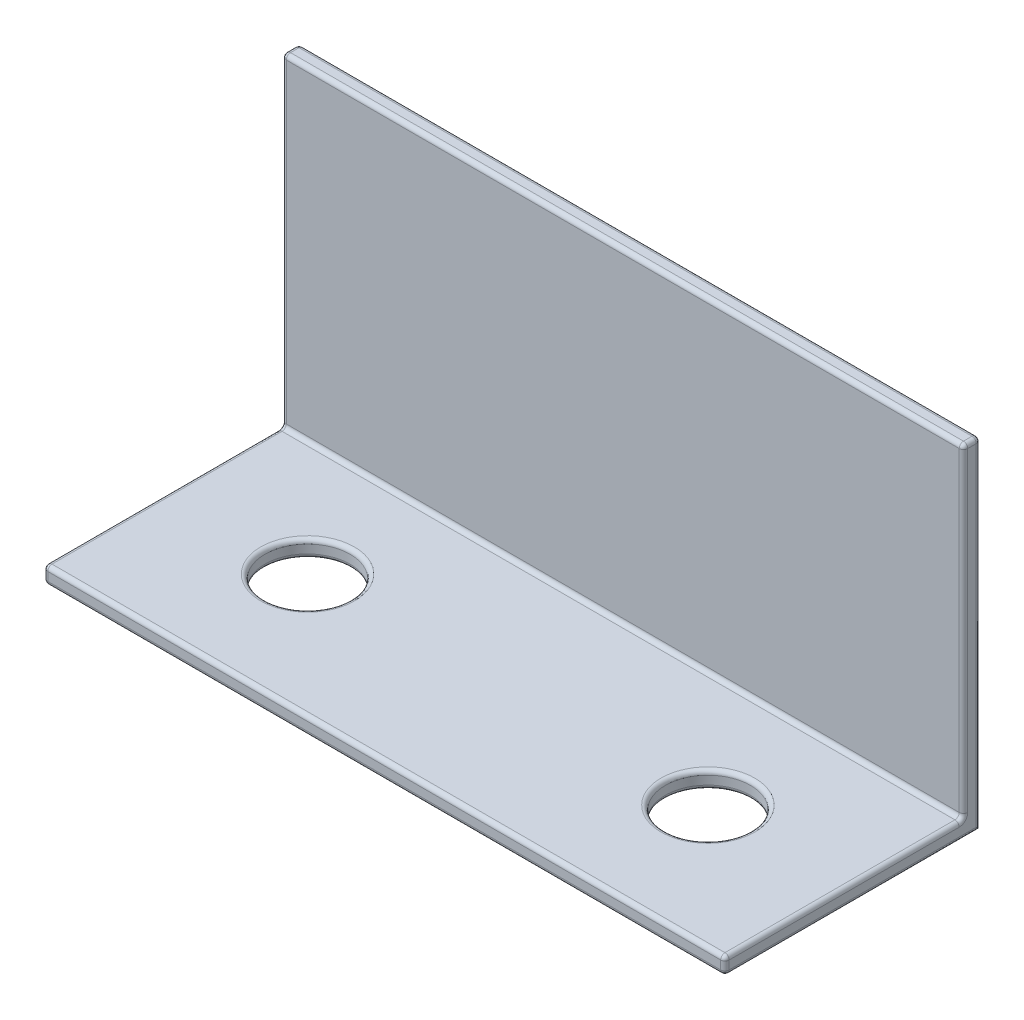
ISO-10303-21;
HEADER;
FILE_DESCRIPTION(('STEP AP214'),'2;1');
FILE_NAME('part.step','',(''),(''),'','','');
FILE_SCHEMA(('AUTOMOTIVE_DESIGN { 1 0 10303 214 1 1 1 1 }'));
ENDSEC;
DATA;
#1=APPLICATION_CONTEXT('core data for automotive mechanical design processes');
#2=APPLICATION_PROTOCOL_DEFINITION('international standard','automotive_design',2000,#1);
#3=PRODUCT_CONTEXT('',#1,'mechanical');
#4=PRODUCT('Part','Part','',(#3));
#5=PRODUCT_RELATED_PRODUCT_CATEGORY('part','',(#4));
#6=PRODUCT_DEFINITION_FORMATION('','',#4);
#7=PRODUCT_DEFINITION_CONTEXT('part definition',#1,'design');
#8=PRODUCT_DEFINITION('design','',#6,#7);
#9=PRODUCT_DEFINITION_SHAPE('','',#8);
#10=(LENGTH_UNIT() NAMED_UNIT(*) SI_UNIT(.MILLI.,.METRE.));
#11=(NAMED_UNIT(*) PLANE_ANGLE_UNIT() SI_UNIT($,.RADIAN.));
#12=(NAMED_UNIT(*) SI_UNIT($,.STERADIAN.) SOLID_ANGLE_UNIT());
#13=UNCERTAINTY_MEASURE_WITH_UNIT(LENGTH_MEASURE(1.E-05),#10,'distance_accuracy_value','');
#14=(GEOMETRIC_REPRESENTATION_CONTEXT(3) GLOBAL_UNCERTAINTY_ASSIGNED_CONTEXT((#13)) GLOBAL_UNIT_ASSIGNED_CONTEXT((#10,
#11,#12)) REPRESENTATION_CONTEXT('',''));
#15=CARTESIAN_POINT('',(0.,0.,0.));
#16=DIRECTION('',(0.,0.,1.));
#17=DIRECTION('',(1.,0.,0.));
#18=AXIS2_PLACEMENT_3D('',#15,#16,#17);
#19=CARTESIAN_POINT('',(40.,0.,0.));
#20=DIRECTION('',(-1.,0.,0.));
#21=DIRECTION('',(0.,0.,1.));
#22=AXIS2_PLACEMENT_3D('',#19,#20,#21);
#23=PLANE('',#22);
#24=CARTESIAN_POINT('',(40.,0.25,-13.75));
#25=DIRECTION('',(-1.,0.,0.));
#26=DIRECTION('',(0.,0.,1.));
#27=AXIS2_PLACEMENT_3D('',#24,#25,#26);
#28=CIRCLE('',#27,0.5);
#29=CARTESIAN_POINT('',(40.,-0.25,-13.75));
#30=VERTEX_POINT('',#29);
#31=CARTESIAN_POINT('',(40.,0.25,-14.25));
#32=VERTEX_POINT('',#31);
#33=EDGE_CURVE('E255',#30,#32,#28,.F.);
#34=ORIENTED_EDGE('',*,*,#33,.F.);
#35=DIRECTION('',(0.,0.,1.));
#36=VECTOR('',#35,1.);
#37=CARTESIAN_POINT('',(40.,-0.25,0.));
#38=LINE('',#37,#36);
#39=CARTESIAN_POINT('',(40.,-0.25,-0.25));
#40=VERTEX_POINT('',#39);
#41=EDGE_CURVE('E252',#30,#40,#38,.T.);
#42=ORIENTED_EDGE('',*,*,#41,.T.);
#43=DIRECTION('',(0.,-1.,0.));
#44=VECTOR('',#43,1.);
#45=CARTESIAN_POINT('',(40.,0.,-0.25));
#46=LINE('',#45,#44);
#47=CARTESIAN_POINT('',(40.,-0.75,-0.25));
#48=VERTEX_POINT('',#47);
#49=EDGE_CURVE('E243',#40,#48,#46,.T.);
#50=ORIENTED_EDGE('',*,*,#49,.T.);
#51=DIRECTION('',(0.,0.,-1.));
#52=VECTOR('',#51,1.);
#53=CARTESIAN_POINT('',(40.,-0.75,0.));
#54=LINE('',#53,#52);
#55=CARTESIAN_POINT('',(40.,-0.749999999999998,-14.75));
#56=VERTEX_POINT('',#55);
#57=EDGE_CURVE('E245',#48,#56,#54,.T.);
#58=ORIENTED_EDGE('',*,*,#57,.T.);
#59=DIRECTION('',(0.,1.,0.));
#60=VECTOR('',#59,1.);
#61=CARTESIAN_POINT('',(40.,0.,-14.75));
#62=LINE('',#61,#60);
#63=CARTESIAN_POINT('',(40.,18.75,-14.75));
#64=VERTEX_POINT('',#63);
#65=EDGE_CURVE('E184',#56,#64,#62,.T.);
#66=ORIENTED_EDGE('',*,*,#65,.T.);
#67=DIRECTION('',(0.,0.,1.));
#68=VECTOR('',#67,1.);
#69=CARTESIAN_POINT('',(40.,18.75,0.));
#70=LINE('',#69,#68);
#71=CARTESIAN_POINT('',(40.,18.75,-14.25));
#72=VERTEX_POINT('',#71);
#73=EDGE_CURVE('E248',#64,#72,#70,.T.);
#74=ORIENTED_EDGE('',*,*,#73,.T.);
#75=DIRECTION('',(0.,-1.,0.));
#76=VECTOR('',#75,1.);
#77=CARTESIAN_POINT('',(40.,0.,-14.25));
#78=LINE('',#77,#76);
#79=EDGE_CURVE('E250',#72,#32,#78,.T.);
#80=ORIENTED_EDGE('',*,*,#79,.T.);
#81=EDGE_LOOP('',(#34,#42,#50,#58,#66,#74,#80));
#82=FACE_BOUND('',#81,.T.);
#83=ADVANCED_FACE('F33',(#82),#23,.F.);
#84=CARTESIAN_POINT('',(40.,-1.,0.));
#85=DIRECTION('',(0.,0.,-1.));
#86=DIRECTION('',(-1.,0.,0.));
#87=AXIS2_PLACEMENT_3D('',#84,#85,#86);
#88=PLANE('',#87);
#89=DIRECTION('',(0.,-1.,0.));
#90=VECTOR('',#89,1.);
#91=CARTESIAN_POINT('',(39.75,-1.,0.));
#92=LINE('',#91,#90);
#93=CARTESIAN_POINT('',(39.75,-0.75,0.));
#94=VERTEX_POINT('',#93);
#95=CARTESIAN_POINT('',(39.75,-0.25,0.));
#96=VERTEX_POINT('',#95);
#97=EDGE_CURVE('E48',#94,#96,#92,.F.);
#98=ORIENTED_EDGE('',*,*,#97,.T.);
#99=DIRECTION('',(-1.,0.,0.));
#100=VECTOR('',#99,1.);
#101=CARTESIAN_POINT('',(40.,-0.25,0.));
#102=LINE('',#101,#100);
#103=CARTESIAN_POINT('',(0.25,-0.25,0.));
#104=VERTEX_POINT('',#103);
#105=EDGE_CURVE('E262',#96,#104,#102,.T.);
#106=ORIENTED_EDGE('',*,*,#105,.T.);
#107=DIRECTION('',(0.,-1.,0.));
#108=VECTOR('',#107,1.);
#109=CARTESIAN_POINT('',(0.25,-1.,0.));
#110=LINE('',#109,#108);
#111=CARTESIAN_POINT('',(0.25,-0.75,0.));
#112=VERTEX_POINT('',#111);
#113=EDGE_CURVE('E258',#104,#112,#110,.T.);
#114=ORIENTED_EDGE('',*,*,#113,.T.);
#115=DIRECTION('',(-1.,0.,0.));
#116=VECTOR('',#115,1.);
#117=CARTESIAN_POINT('',(40.,-0.75,0.));
#118=LINE('',#117,#116);
#119=EDGE_CURVE('E53',#112,#94,#118,.F.);
#120=ORIENTED_EDGE('',*,*,#119,.T.);
#121=EDGE_LOOP('',(#98,#106,#114,#120));
#122=FACE_BOUND('',#121,.T.);
#123=ADVANCED_FACE('F391',(#122),#88,.F.);
#124=CARTESIAN_POINT('',(40.,-0.999999999999998,-15.));
#125=DIRECTION('',(0.,1.,0.));
#126=DIRECTION('',(0.,0.,1.));
#127=AXIS2_PLACEMENT_3D('',#124,#125,#126);
#128=PLANE('',#127);
#129=CARTESIAN_POINT('',(31.75,-0.999999999999999,-7.25));
#130=DIRECTION('',(0.,1.,0.));
#131=DIRECTION('',(0.,0.,1.));
#132=AXIS2_PLACEMENT_3D('',#129,#130,#131);
#133=CIRCLE('',#132,2.75);
#134=CARTESIAN_POINT('',(31.75,-0.999999999999999,-4.5));
#135=VERTEX_POINT('',#134);
#136=EDGE_CURVE('E354',#135,#135,#133,.T.);
#137=ORIENTED_EDGE('',*,*,#136,.T.);
#138=EDGE_LOOP('',(#137));
#139=FACE_BOUND('',#138,.T.);
#140=CARTESIAN_POINT('',(8.25,-0.999999999999999,-7.25));
#141=DIRECTION('',(0.,1.,0.));
#142=DIRECTION('',(0.,0.,1.));
#143=AXIS2_PLACEMENT_3D('',#140,#141,#142);
#144=CIRCLE('',#143,2.75);
#145=CARTESIAN_POINT('',(8.25,-0.999999999999999,-4.5));
#146=VERTEX_POINT('',#145);
#147=EDGE_CURVE('E351',#146,#146,#144,.T.);
#148=ORIENTED_EDGE('',*,*,#147,.T.);
#149=EDGE_LOOP('',(#148));
#150=FACE_BOUND('',#149,.T.);
#151=DIRECTION('',(-1.,0.,0.));
#152=VECTOR('',#151,1.);
#153=CARTESIAN_POINT('',(40.,-1.,-0.25));
#154=LINE('',#153,#152);
#155=CARTESIAN_POINT('',(39.75,-1.,-0.25));
#156=VERTEX_POINT('',#155);
#157=CARTESIAN_POINT('',(0.25,-1.,-0.25));
#158=VERTEX_POINT('',#157);
#159=EDGE_CURVE('E177',#156,#158,#154,.T.);
#160=ORIENTED_EDGE('',*,*,#159,.T.);
#161=DIRECTION('',(0.,0.,-1.));
#162=VECTOR('',#161,1.);
#163=CARTESIAN_POINT('',(0.25,-0.999999999999998,-15.));
#164=LINE('',#163,#162);
#165=CARTESIAN_POINT('',(0.25,-0.999999999999998,-15.));
#166=VERTEX_POINT('',#165);
#167=EDGE_CURVE('E176',#158,#166,#164,.T.);
#168=ORIENTED_EDGE('',*,*,#167,.T.);
#169=DIRECTION('',(-1.,0.,0.));
#170=VECTOR('',#169,1.);
#171=CARTESIAN_POINT('',(40.,-0.999999999999998,-15.));
#172=LINE('',#171,#170);
#173=CARTESIAN_POINT('',(39.75,-0.999999999999998,-15.));
#174=VERTEX_POINT('',#173);
#175=EDGE_CURVE('E160',#174,#166,#172,.T.);
#176=ORIENTED_EDGE('',*,*,#175,.F.);
#177=DIRECTION('',(0.,0.,-1.));
#178=VECTOR('',#177,1.);
#179=CARTESIAN_POINT('',(39.75,-0.999999999999998,-15.));
#180=LINE('',#179,#178);
#181=EDGE_CURVE('E173',#174,#156,#180,.F.);
#182=ORIENTED_EDGE('',*,*,#181,.T.);
#183=EDGE_LOOP('',(#160,#168,#176,#182));
#184=FACE_BOUND('',#183,.T.);
#185=ADVANCED_FACE('F171',(#139,#150,#184),#128,.F.);
#186=CARTESIAN_POINT('',(40.,19.,-15.));
#187=DIRECTION('',(0.,0.,1.));
#188=DIRECTION('',(0.,-1.,0.));
#189=AXIS2_PLACEMENT_3D('',#186,#187,#188);
#190=PLANE('',#189);
#191=ORIENTED_EDGE('',*,*,#175,.T.);
#192=DIRECTION('',(0.,1.,0.));
#193=VECTOR('',#192,1.);
#194=CARTESIAN_POINT('',(0.25,19.,-15.));
#195=LINE('',#194,#193);
#196=CARTESIAN_POINT('',(0.25,18.75,-15.));
#197=VERTEX_POINT('',#196);
#198=EDGE_CURVE('E214',#166,#197,#195,.T.);
#199=ORIENTED_EDGE('',*,*,#198,.T.);
#200=DIRECTION('',(-1.,0.,0.));
#201=VECTOR('',#200,1.);
#202=CARTESIAN_POINT('',(40.,18.75,-15.));
#203=LINE('',#202,#201);
#204=CARTESIAN_POINT('',(39.75,18.75,-15.));
#205=VERTEX_POINT('',#204);
#206=EDGE_CURVE('E162',#197,#205,#203,.F.);
#207=ORIENTED_EDGE('',*,*,#206,.T.);
#208=DIRECTION('',(0.,1.,0.));
#209=VECTOR('',#208,1.);
#210=CARTESIAN_POINT('',(39.75,19.,-15.));
#211=LINE('',#210,#209);
#212=EDGE_CURVE('E157',#205,#174,#211,.F.);
#213=ORIENTED_EDGE('',*,*,#212,.T.);
#214=EDGE_LOOP('',(#191,#199,#207,#213));
#215=FACE_BOUND('',#214,.T.);
#216=ADVANCED_FACE('F159',(#215),#190,.F.);
#217=CARTESIAN_POINT('',(40.,19.,-14.));
#218=DIRECTION('',(0.,-1.,0.));
#219=DIRECTION('',(0.,0.,-1.));
#220=AXIS2_PLACEMENT_3D('',#217,#218,#219);
#221=PLANE('',#220);
#222=DIRECTION('',(-1.,0.,0.));
#223=VECTOR('',#222,1.);
#224=CARTESIAN_POINT('',(40.,19.,-14.75));
#225=LINE('',#224,#223);
#226=CARTESIAN_POINT('',(39.75,19.,-14.75));
#227=VERTEX_POINT('',#226);
#228=CARTESIAN_POINT('',(0.25,19.,-14.75));
#229=VERTEX_POINT('',#228);
#230=EDGE_CURVE('E238',#227,#229,#225,.T.);
#231=ORIENTED_EDGE('',*,*,#230,.T.);
#232=DIRECTION('',(0.,0.,1.));
#233=VECTOR('',#232,1.);
#234=CARTESIAN_POINT('',(0.25,19.,-14.));
#235=LINE('',#234,#233);
#236=CARTESIAN_POINT('',(0.25,19.,-14.25));
#237=VERTEX_POINT('',#236);
#238=EDGE_CURVE('E241',#229,#237,#235,.T.);
#239=ORIENTED_EDGE('',*,*,#238,.T.);
#240=DIRECTION('',(-1.,0.,0.));
#241=VECTOR('',#240,1.);
#242=CARTESIAN_POINT('',(40.,19.,-14.25));
#243=LINE('',#242,#241);
#244=CARTESIAN_POINT('',(39.75,19.,-14.25));
#245=VERTEX_POINT('',#244);
#246=EDGE_CURVE('E236',#237,#245,#243,.F.);
#247=ORIENTED_EDGE('',*,*,#246,.T.);
#248=DIRECTION('',(0.,0.,1.));
#249=VECTOR('',#248,1.);
#250=CARTESIAN_POINT('',(39.75,19.,-14.));
#251=LINE('',#250,#249);
#252=EDGE_CURVE('E234',#245,#227,#251,.F.);
#253=ORIENTED_EDGE('',*,*,#252,.T.);
#254=EDGE_LOOP('',(#231,#239,#247,#253));
#255=FACE_BOUND('',#254,.T.);
#256=ADVANCED_FACE('F409',(#255),#221,.F.);
#257=CARTESIAN_POINT('',(40.,0.,-14.));
#258=DIRECTION('',(0.,0.,-1.));
#259=DIRECTION('',(-1.,0.,0.));
#260=AXIS2_PLACEMENT_3D('',#257,#258,#259);
#261=PLANE('',#260);
#262=DIRECTION('',(-1.,0.,0.));
#263=VECTOR('',#262,1.);
#264=CARTESIAN_POINT('',(40.,18.75,-14.));
#265=LINE('',#264,#263);
#266=CARTESIAN_POINT('',(39.75,18.75,-14.));
#267=VERTEX_POINT('',#266);
#268=CARTESIAN_POINT('',(0.25,18.75,-14.));
#269=VERTEX_POINT('',#268);
#270=EDGE_CURVE('E220',#267,#269,#265,.T.);
#271=ORIENTED_EDGE('',*,*,#270,.T.);
#272=DIRECTION('',(0.,-1.,0.));
#273=VECTOR('',#272,1.);
#274=CARTESIAN_POINT('',(0.25,0.,-14.));
#275=LINE('',#274,#273);
#276=CARTESIAN_POINT('',(0.25,0.25,-14.));
#277=VERTEX_POINT('',#276);
#278=EDGE_CURVE('E222',#269,#277,#275,.T.);
#279=ORIENTED_EDGE('',*,*,#278,.T.);
#280=DIRECTION('',(-1.,0.,0.));
#281=VECTOR('',#280,1.);
#282=CARTESIAN_POINT('',(40.,0.25,-14.));
#283=LINE('',#282,#281);
#284=CARTESIAN_POINT('',(39.75,0.25,-14.));
#285=VERTEX_POINT('',#284);
#286=EDGE_CURVE('E216',#277,#285,#283,.F.);
#287=ORIENTED_EDGE('',*,*,#286,.T.);
#288=DIRECTION('',(0.,-1.,0.));
#289=VECTOR('',#288,1.);
#290=CARTESIAN_POINT('',(39.75,0.,-14.));
#291=LINE('',#290,#289);
#292=EDGE_CURVE('E218',#285,#267,#291,.F.);
#293=ORIENTED_EDGE('',*,*,#292,.T.);
#294=EDGE_LOOP('',(#271,#279,#287,#293));
#295=FACE_BOUND('',#294,.T.);
#296=ADVANCED_FACE('F405',(#295),#261,.F.);
#297=CARTESIAN_POINT('',(40.,0.,0.));
#298=DIRECTION('',(0.,-1.,0.));
#299=DIRECTION('',(0.,0.,-1.));
#300=AXIS2_PLACEMENT_3D('',#297,#298,#299);
#301=PLANE('',#300);
#302=CARTESIAN_POINT('',(8.25,0.,-7.25));
#303=DIRECTION('',(0.,-1.,0.));
#304=DIRECTION('',(0.,0.,-1.));
#305=AXIS2_PLACEMENT_3D('',#302,#303,#304);
#306=CIRCLE('',#305,2.75);
#307=CARTESIAN_POINT('',(8.25,0.,-10.));
#308=VERTEX_POINT('',#307);
#309=EDGE_CURVE('E11',#308,#308,#306,.T.);
#310=ORIENTED_EDGE('',*,*,#309,.T.);
#311=EDGE_LOOP('',(#310));
#312=FACE_BOUND('',#311,.T.);
#313=CARTESIAN_POINT('',(31.75,0.,-7.25));
#314=DIRECTION('',(0.,-1.,0.));
#315=DIRECTION('',(0.,0.,-1.));
#316=AXIS2_PLACEMENT_3D('',#313,#314,#315);
#317=CIRCLE('',#316,2.75);
#318=CARTESIAN_POINT('',(31.75,0.,-10.));
#319=VERTEX_POINT('',#318);
#320=EDGE_CURVE('E41',#319,#319,#317,.T.);
#321=ORIENTED_EDGE('',*,*,#320,.T.);
#322=EDGE_LOOP('',(#321));
#323=FACE_BOUND('',#322,.T.);
#324=DIRECTION('',(0.,0.,1.));
#325=VECTOR('',#324,1.);
#326=CARTESIAN_POINT('',(0.25,0.,0.));
#327=LINE('',#326,#325);
#328=CARTESIAN_POINT('',(0.25,0.,-13.75));
#329=VERTEX_POINT('',#328);
#330=CARTESIAN_POINT('',(0.25,0.,-0.25));
#331=VERTEX_POINT('',#330);
#332=EDGE_CURVE('E229',#329,#331,#327,.T.);
#333=ORIENTED_EDGE('',*,*,#332,.T.);
#334=DIRECTION('',(-1.,0.,0.));
#335=VECTOR('',#334,1.);
#336=CARTESIAN_POINT('',(40.,0.,-0.25));
#337=LINE('',#336,#335);
#338=CARTESIAN_POINT('',(39.75,0.,-0.25));
#339=VERTEX_POINT('',#338);
#340=EDGE_CURVE('E232',#331,#339,#337,.F.);
#341=ORIENTED_EDGE('',*,*,#340,.T.);
#342=DIRECTION('',(0.,0.,1.));
#343=VECTOR('',#342,1.);
#344=CARTESIAN_POINT('',(39.75,0.,0.));
#345=LINE('',#344,#343);
#346=CARTESIAN_POINT('',(39.75,0.,-13.75));
#347=VERTEX_POINT('',#346);
#348=EDGE_CURVE('E227',#339,#347,#345,.F.);
#349=ORIENTED_EDGE('',*,*,#348,.T.);
#350=DIRECTION('',(-1.,0.,0.));
#351=VECTOR('',#350,1.);
#352=CARTESIAN_POINT('',(0.,0.,-13.75));
#353=LINE('',#352,#351);
#354=EDGE_CURVE('E225',#347,#329,#353,.T.);
#355=ORIENTED_EDGE('',*,*,#354,.T.);
#356=EDGE_LOOP('',(#333,#341,#349,#355));
#357=FACE_BOUND('',#356,.T.);
#358=ADVANCED_FACE('F365',(#312,#323,#357),#301,.F.);
#359=CARTESIAN_POINT('',(0.,0.,0.));
#360=DIRECTION('',(-1.,0.,0.));
#361=DIRECTION('',(0.,0.,1.));
#362=AXIS2_PLACEMENT_3D('',#359,#360,#361);
#363=PLANE('',#362);
#364=DIRECTION('',(0.,-1.,0.));
#365=VECTOR('',#364,1.);
#366=CARTESIAN_POINT('',(0.,19.,-14.25));
#367=LINE('',#366,#365);
#368=CARTESIAN_POINT('',(0.,0.25,-14.25));
#369=VERTEX_POINT('',#368);
#370=CARTESIAN_POINT('',(0.,18.75,-14.25));
#371=VERTEX_POINT('',#370);
#372=EDGE_CURVE('E208',#369,#371,#367,.F.);
#373=ORIENTED_EDGE('',*,*,#372,.T.);
#374=DIRECTION('',(0.,0.,1.));
#375=VECTOR('',#374,1.);
#376=CARTESIAN_POINT('',(0.,18.75,-15.));
#377=LINE('',#376,#375);
#378=CARTESIAN_POINT('',(0.,18.75,-14.75));
#379=VERTEX_POINT('',#378);
#380=EDGE_CURVE('E167',#371,#379,#377,.F.);
#381=ORIENTED_EDGE('',*,*,#380,.T.);
#382=DIRECTION('',(0.,1.,0.));
#383=VECTOR('',#382,1.);
#384=CARTESIAN_POINT('',(0.,-0.999999999999997,-14.75));
#385=LINE('',#384,#383);
#386=CARTESIAN_POINT('',(0.,-0.749999999999998,-14.75));
#387=VERTEX_POINT('',#386);
#388=EDGE_CURVE('E210',#379,#387,#385,.F.);
#389=ORIENTED_EDGE('',*,*,#388,.T.);
#390=DIRECTION('',(0.,0.,-1.));
#391=VECTOR('',#390,1.);
#392=CARTESIAN_POINT('',(0.,-0.75,0.));
#393=LINE('',#392,#391);
#394=CARTESIAN_POINT('',(0.,-0.75,-0.25));
#395=VERTEX_POINT('',#394);
#396=EDGE_CURVE('E202',#387,#395,#393,.F.);
#397=ORIENTED_EDGE('',*,*,#396,.T.);
#398=DIRECTION('',(0.,-1.,0.));
#399=VECTOR('',#398,1.);
#400=CARTESIAN_POINT('',(0.,0.,-0.25));
#401=LINE('',#400,#399);
#402=CARTESIAN_POINT('',(0.,-0.25,-0.25));
#403=VERTEX_POINT('',#402);
#404=EDGE_CURVE('E195',#395,#403,#401,.F.);
#405=ORIENTED_EDGE('',*,*,#404,.T.);
#406=DIRECTION('',(0.,0.,1.));
#407=VECTOR('',#406,1.);
#408=CARTESIAN_POINT('',(0.,-0.25,-14.));
#409=LINE('',#408,#407);
#410=CARTESIAN_POINT('',(0.,-0.25,-13.75));
#411=VERTEX_POINT('',#410);
#412=EDGE_CURVE('E200',#403,#411,#409,.F.);
#413=ORIENTED_EDGE('',*,*,#412,.T.);
#414=CARTESIAN_POINT('',(0.,0.25,-13.75));
#415=DIRECTION('',(-1.,0.,0.));
#416=DIRECTION('',(0.,0.,1.));
#417=AXIS2_PLACEMENT_3D('',#414,#415,#416);
#418=CIRCLE('',#417,0.5);
#419=EDGE_CURVE('E205',#369,#411,#418,.T.);
#420=ORIENTED_EDGE('',*,*,#419,.F.);
#421=EDGE_LOOP('',(#373,#381,#389,#397,#405,#413,#420));
#422=FACE_BOUND('',#421,.T.);
#423=ADVANCED_FACE('F398',(#422),#363,.T.);
#424=CARTESIAN_POINT('',(39.75,0.25,-13.75));
#425=DIRECTION('',(-1.,0.,0.));
#426=DIRECTION('',(0.,0.,1.));
#427=AXIS2_PLACEMENT_3D('',#424,#425,#426);
#428=TOROIDAL_SURFACE('',#427,0.5,0.25);
#429=CARTESIAN_POINT('',(39.75,-0.25,-13.75));
#430=DIRECTION('',(0.,0.,-1.));
#431=DIRECTION('',(-1.,0.,0.));
#432=AXIS2_PLACEMENT_3D('',#429,#430,#431);
#433=CIRCLE('',#432,0.25);
#434=EDGE_CURVE('E338',#30,#347,#433,.F.);
#435=ORIENTED_EDGE('',*,*,#434,.F.);
#436=ORIENTED_EDGE('',*,*,#33,.T.);
#437=CARTESIAN_POINT('',(39.75,0.25,-14.25));
#438=DIRECTION('',(0.,-1.,0.));
#439=DIRECTION('',(0.,0.,-1.));
#440=AXIS2_PLACEMENT_3D('',#437,#438,#439);
#441=CIRCLE('',#440,0.25);
#442=EDGE_CURVE('E178',#285,#32,#441,.F.);
#443=ORIENTED_EDGE('',*,*,#442,.F.);
#444=CARTESIAN_POINT('',(39.75,0.25,-13.75));
#445=DIRECTION('',(-1.,0.,0.));
#446=DIRECTION('',(0.,0.,1.));
#447=AXIS2_PLACEMENT_3D('',#444,#445,#446);
#448=CIRCLE('',#447,0.25);
#449=EDGE_CURVE('E341',#347,#285,#448,.F.);
#450=ORIENTED_EDGE('',*,*,#449,.F.);
#451=EDGE_LOOP('',(#435,#436,#443,#450));
#452=FACE_BOUND('',#451,.T.);
#453=ADVANCED_FACE('F401',(#452),#428,.T.);
#454=CARTESIAN_POINT('',(39.75,0.,-14.25));
#455=DIRECTION('',(0.,-1.,0.));
#456=DIRECTION('',(0.,0.,-1.));
#457=AXIS2_PLACEMENT_3D('',#454,#455,#456);
#458=CYLINDRICAL_SURFACE('',#457,0.25);
#459=ORIENTED_EDGE('',*,*,#442,.T.);
#460=ORIENTED_EDGE('',*,*,#79,.F.);
#461=CARTESIAN_POINT('',(39.75,18.75,-14.25));
#462=DIRECTION('',(0.,1.,0.));
#463=DIRECTION('',(0.,0.,1.));
#464=AXIS2_PLACEMENT_3D('',#461,#462,#463);
#465=CIRCLE('',#464,0.25);
#466=EDGE_CURVE('E335',#267,#72,#465,.T.);
#467=ORIENTED_EDGE('',*,*,#466,.F.);
#468=ORIENTED_EDGE('',*,*,#292,.F.);
#469=EDGE_LOOP('',(#459,#460,#467,#468));
#470=FACE_BOUND('',#469,.T.);
#471=ADVANCED_FACE('F509',(#470),#458,.T.);
#472=CARTESIAN_POINT('',(40.,0.25,-13.75));
#473=DIRECTION('',(1.,0.,0.));
#474=DIRECTION('',(0.,0.,-1.));
#475=AXIS2_PLACEMENT_3D('',#472,#473,#474);
#476=CYLINDRICAL_SURFACE('',#475,0.25);
#477=ORIENTED_EDGE('',*,*,#449,.T.);
#478=ORIENTED_EDGE('',*,*,#286,.F.);
#479=CARTESIAN_POINT('',(0.25,0.25,-13.75));
#480=DIRECTION('',(-1.,0.,0.));
#481=DIRECTION('',(0.,0.,1.));
#482=AXIS2_PLACEMENT_3D('',#479,#480,#481);
#483=CIRCLE('',#482,0.25);
#484=EDGE_CURVE('E332',#329,#277,#483,.F.);
#485=ORIENTED_EDGE('',*,*,#484,.F.);
#486=ORIENTED_EDGE('',*,*,#354,.F.);
#487=EDGE_LOOP('',(#477,#478,#485,#486));
#488=FACE_BOUND('',#487,.T.);
#489=ADVANCED_FACE('F505',(#488),#476,.F.);
#490=CARTESIAN_POINT('',(39.75,-0.25,0.));
#491=DIRECTION('',(0.,0.,1.));
#492=DIRECTION('',(1.,0.,0.));
#493=AXIS2_PLACEMENT_3D('',#490,#491,#492);
#494=CYLINDRICAL_SURFACE('',#493,0.25);
#495=ORIENTED_EDGE('',*,*,#434,.T.);
#496=ORIENTED_EDGE('',*,*,#348,.F.);
#497=CARTESIAN_POINT('',(39.75,-0.25,-0.25));
#498=DIRECTION('',(0.,0.,1.));
#499=DIRECTION('',(1.,0.,0.));
#500=AXIS2_PLACEMENT_3D('',#497,#498,#499);
#501=CIRCLE('',#500,0.25);
#502=EDGE_CURVE('E329',#40,#339,#501,.T.);
#503=ORIENTED_EDGE('',*,*,#502,.F.);
#504=ORIENTED_EDGE('',*,*,#41,.F.);
#505=EDGE_LOOP('',(#495,#496,#503,#504));
#506=FACE_BOUND('',#505,.T.);
#507=ADVANCED_FACE('F501',(#506),#494,.T.);
#508=CARTESIAN_POINT('',(39.75,18.75,-14.25));
#509=DIRECTION('',(0.,0.,1.));
#510=DIRECTION('',(1.,0.,0.));
#511=AXIS2_PLACEMENT_3D('',#508,#509,#510);
#512=SPHERICAL_SURFACE('',#511,0.25);
#513=CARTESIAN_POINT('',(39.75,18.75,-14.25));
#514=DIRECTION('',(1.,0.,0.));
#515=DIRECTION('',(0.,0.,-1.));
#516=AXIS2_PLACEMENT_3D('',#513,#514,#515);
#517=CIRCLE('',#516,0.25);
#518=EDGE_CURVE('E323',#267,#245,#517,.F.);
#519=ORIENTED_EDGE('',*,*,#518,.F.);
#520=ORIENTED_EDGE('',*,*,#466,.T.);
#521=CARTESIAN_POINT('',(39.75,18.75,-14.25));
#522=DIRECTION('',(0.,0.,1.));
#523=DIRECTION('',(0.,-1.,0.));
#524=AXIS2_PLACEMENT_3D('',#521,#522,#523);
#525=CIRCLE('',#524,0.25);
#526=EDGE_CURVE('E326',#245,#72,#525,.F.);
#527=ORIENTED_EDGE('',*,*,#526,.F.);
#528=EDGE_LOOP('',(#519,#520,#527));
#529=FACE_BOUND('',#528,.T.);
#530=ADVANCED_FACE('F497',(#529),#512,.T.);
#531=CARTESIAN_POINT('',(0.25,0.25,-13.75));
#532=DIRECTION('',(-1.,0.,0.));
#533=DIRECTION('',(0.,0.,1.));
#534=AXIS2_PLACEMENT_3D('',#531,#532,#533);
#535=TOROIDAL_SURFACE('',#534,0.5,0.25);
#536=CARTESIAN_POINT('',(0.25,-0.25,-13.75));
#537=DIRECTION('',(0.,0.,-1.));
#538=DIRECTION('',(-1.,0.,0.));
#539=AXIS2_PLACEMENT_3D('',#536,#537,#538);
#540=CIRCLE('',#539,0.25);
#541=EDGE_CURVE('E318',#329,#411,#540,.F.);
#542=ORIENTED_EDGE('',*,*,#541,.F.);
#543=ORIENTED_EDGE('',*,*,#484,.T.);
#544=CARTESIAN_POINT('',(0.25,0.25,-14.25));
#545=DIRECTION('',(0.,-1.,0.));
#546=DIRECTION('',(0.,0.,-1.));
#547=AXIS2_PLACEMENT_3D('',#544,#545,#546);
#548=CIRCLE('',#547,0.25);
#549=EDGE_CURVE('E321',#369,#277,#548,.F.);
#550=ORIENTED_EDGE('',*,*,#549,.F.);
#551=ORIENTED_EDGE('',*,*,#419,.T.);
#552=EDGE_LOOP('',(#542,#543,#550,#551));
#553=FACE_BOUND('',#552,.T.);
#554=ADVANCED_FACE('F493',(#553),#535,.T.);
#555=CARTESIAN_POINT('',(39.75,-0.25,-0.25));
#556=DIRECTION('',(0.,0.,1.));
#557=DIRECTION('',(1.,0.,0.));
#558=AXIS2_PLACEMENT_3D('',#555,#556,#557);
#559=SPHERICAL_SURFACE('',#558,0.25);
#560=CARTESIAN_POINT('',(39.75,-0.25,-0.25));
#561=DIRECTION('',(0.,1.,0.));
#562=DIRECTION('',(0.,0.,1.));
#563=AXIS2_PLACEMENT_3D('',#560,#561,#562);
#564=CIRCLE('',#563,0.25);
#565=EDGE_CURVE('E187',#40,#96,#564,.F.);
#566=ORIENTED_EDGE('',*,*,#565,.F.);
#567=ORIENTED_EDGE('',*,*,#502,.T.);
#568=CARTESIAN_POINT('',(39.75,-0.25,-0.25));
#569=DIRECTION('',(1.,0.,0.));
#570=DIRECTION('',(0.,0.,-1.));
#571=AXIS2_PLACEMENT_3D('',#568,#569,#570);
#572=CIRCLE('',#571,0.25);
#573=EDGE_CURVE('E315',#96,#339,#572,.F.);
#574=ORIENTED_EDGE('',*,*,#573,.F.);
#575=EDGE_LOOP('',(#566,#567,#574));
#576=FACE_BOUND('',#575,.T.);
#577=ADVANCED_FACE('F490',(#576),#559,.T.);
#578=CARTESIAN_POINT('',(39.75,0.,-14.75));
#579=DIRECTION('',(0.,1.,0.));
#580=DIRECTION('',(0.,0.,1.));
#581=AXIS2_PLACEMENT_3D('',#578,#579,#580);
#582=CYLINDRICAL_SURFACE('',#581,0.25);
#583=CARTESIAN_POINT('',(39.75,18.75,-14.75));
#584=DIRECTION('',(0.,1.,0.));
#585=DIRECTION('',(0.,0.,1.));
#586=AXIS2_PLACEMENT_3D('',#583,#584,#585);
#587=CIRCLE('',#586,0.25);
#588=EDGE_CURVE('E188',#64,#205,#587,.T.);
#589=ORIENTED_EDGE('',*,*,#588,.F.);
#590=ORIENTED_EDGE('',*,*,#65,.F.);
#591=CARTESIAN_POINT('',(39.75,-0.749999999999998,-14.75));
#592=DIRECTION('',(0.,0.707106781186548,-0.707106781186547));
#593=DIRECTION('',(0.,-0.707106781186547,-0.707106781186548));
#594=AXIS2_PLACEMENT_3D('',#591,#592,#593);
#595=ELLIPSE('',#594,0.353553390593274,0.25);
#596=EDGE_CURVE('E182',#174,#56,#595,.F.);
#597=ORIENTED_EDGE('',*,*,#596,.F.);
#598=ORIENTED_EDGE('',*,*,#212,.F.);
#599=EDGE_LOOP('',(#589,#590,#597,#598));
#600=FACE_BOUND('',#599,.T.);
#601=ADVANCED_FACE('F183',(#600),#582,.T.);
#602=CARTESIAN_POINT('',(39.75,18.75,0.));
#603=DIRECTION('',(0.,0.,1.));
#604=DIRECTION('',(0.,-1.,0.));
#605=AXIS2_PLACEMENT_3D('',#602,#603,#604);
#606=CYLINDRICAL_SURFACE('',#605,0.25);
#607=ORIENTED_EDGE('',*,*,#526,.T.);
#608=ORIENTED_EDGE('',*,*,#73,.F.);
#609=CARTESIAN_POINT('',(39.75,18.75,-14.75));
#610=DIRECTION('',(0.,0.,-1.));
#611=DIRECTION('',(-1.,0.,0.));
#612=AXIS2_PLACEMENT_3D('',#609,#610,#611);
#613=CIRCLE('',#612,0.25);
#614=EDGE_CURVE('E310',#227,#64,#613,.T.);
#615=ORIENTED_EDGE('',*,*,#614,.F.);
#616=ORIENTED_EDGE('',*,*,#252,.F.);
#617=EDGE_LOOP('',(#607,#608,#615,#616));
#618=FACE_BOUND('',#617,.T.);
#619=ADVANCED_FACE('F483',(#618),#606,.T.);
#620=CARTESIAN_POINT('',(40.,18.75,-14.25));
#621=DIRECTION('',(-1.,0.,0.));
#622=DIRECTION('',(0.,0.,1.));
#623=AXIS2_PLACEMENT_3D('',#620,#621,#622);
#624=CYLINDRICAL_SURFACE('',#623,0.25);
#625=ORIENTED_EDGE('',*,*,#518,.T.);
#626=ORIENTED_EDGE('',*,*,#246,.F.);
#627=CARTESIAN_POINT('',(0.25,18.75,-14.25));
#628=DIRECTION('',(-1.,0.,0.));
#629=DIRECTION('',(0.,0.,1.));
#630=AXIS2_PLACEMENT_3D('',#627,#628,#629);
#631=CIRCLE('',#630,0.25);
#632=EDGE_CURVE('E307',#269,#237,#631,.T.);
#633=ORIENTED_EDGE('',*,*,#632,.F.);
#634=ORIENTED_EDGE('',*,*,#270,.F.);
#635=EDGE_LOOP('',(#625,#626,#633,#634));
#636=FACE_BOUND('',#635,.T.);
#637=ADVANCED_FACE('F479',(#636),#624,.T.);
#638=CARTESIAN_POINT('',(0.25,0.,-14.25));
#639=DIRECTION('',(0.,1.,0.));
#640=DIRECTION('',(0.,0.,1.));
#641=AXIS2_PLACEMENT_3D('',#638,#639,#640);
#642=CYLINDRICAL_SURFACE('',#641,0.25);
#643=ORIENTED_EDGE('',*,*,#549,.T.);
#644=ORIENTED_EDGE('',*,*,#278,.F.);
#645=CARTESIAN_POINT('',(0.25,18.75,-14.25));
#646=DIRECTION('',(0.,1.,0.));
#647=DIRECTION('',(0.,0.,1.));
#648=AXIS2_PLACEMENT_3D('',#645,#646,#647);
#649=CIRCLE('',#648,0.25);
#650=EDGE_CURVE('E304',#371,#269,#649,.T.);
#651=ORIENTED_EDGE('',*,*,#650,.F.);
#652=ORIENTED_EDGE('',*,*,#372,.F.);
#653=EDGE_LOOP('',(#643,#644,#651,#652));
#654=FACE_BOUND('',#653,.T.);
#655=ADVANCED_FACE('F475',(#654),#642,.T.);
#656=CARTESIAN_POINT('',(0.25,-0.25,0.));
#657=DIRECTION('',(0.,0.,-1.));
#658=DIRECTION('',(-1.,0.,0.));
#659=AXIS2_PLACEMENT_3D('',#656,#657,#658);
#660=CYLINDRICAL_SURFACE('',#659,0.25);
#661=ORIENTED_EDGE('',*,*,#541,.T.);
#662=ORIENTED_EDGE('',*,*,#412,.F.);
#663=CARTESIAN_POINT('',(0.25,-0.25,-0.25));
#664=DIRECTION('',(0.,0.,1.));
#665=DIRECTION('',(1.,0.,0.));
#666=AXIS2_PLACEMENT_3D('',#663,#664,#665);
#667=CIRCLE('',#666,0.25);
#668=EDGE_CURVE('E301',#331,#403,#667,.T.);
#669=ORIENTED_EDGE('',*,*,#668,.F.);
#670=ORIENTED_EDGE('',*,*,#332,.F.);
#671=EDGE_LOOP('',(#661,#662,#669,#670));
#672=FACE_BOUND('',#671,.T.);
#673=ADVANCED_FACE('F471',(#672),#660,.T.);
#674=CARTESIAN_POINT('',(40.,-0.25,-0.25));
#675=DIRECTION('',(-1.,0.,0.));
#676=DIRECTION('',(0.,0.,1.));
#677=AXIS2_PLACEMENT_3D('',#674,#675,#676);
#678=CYLINDRICAL_SURFACE('',#677,0.25);
#679=ORIENTED_EDGE('',*,*,#573,.T.);
#680=ORIENTED_EDGE('',*,*,#340,.F.);
#681=CARTESIAN_POINT('',(0.25,-0.25,-0.25));
#682=DIRECTION('',(-1.,0.,0.));
#683=DIRECTION('',(0.,0.,1.));
#684=AXIS2_PLACEMENT_3D('',#681,#682,#683);
#685=CIRCLE('',#684,0.25);
#686=EDGE_CURVE('E299',#104,#331,#685,.T.);
#687=ORIENTED_EDGE('',*,*,#686,.F.);
#688=ORIENTED_EDGE('',*,*,#105,.F.);
#689=EDGE_LOOP('',(#679,#680,#687,#688));
#690=FACE_BOUND('',#689,.T.);
#691=ADVANCED_FACE('F467',(#690),#678,.T.);
#692=CARTESIAN_POINT('',(39.75,0.,-0.25));
#693=DIRECTION('',(0.,-1.,0.));
#694=DIRECTION('',(0.,0.,-1.));
#695=AXIS2_PLACEMENT_3D('',#692,#693,#694);
#696=CYLINDRICAL_SURFACE('',#695,0.25);
#697=ORIENTED_EDGE('',*,*,#565,.T.);
#698=ORIENTED_EDGE('',*,*,#97,.F.);
#699=CARTESIAN_POINT('',(39.75,-0.75,-0.25));
#700=DIRECTION('',(0.,-1.,0.));
#701=DIRECTION('',(0.,0.,-1.));
#702=AXIS2_PLACEMENT_3D('',#699,#700,#701);
#703=CIRCLE('',#702,0.25);
#704=EDGE_CURVE('E296',#48,#94,#703,.T.);
#705=ORIENTED_EDGE('',*,*,#704,.F.);
#706=ORIENTED_EDGE('',*,*,#49,.F.);
#707=EDGE_LOOP('',(#697,#698,#705,#706));
#708=FACE_BOUND('',#707,.T.);
#709=ADVANCED_FACE('F464',(#708),#696,.T.);
#710=CARTESIAN_POINT('',(39.75,-0.75,0.));
#711=DIRECTION('',(0.,0.,-1.));
#712=DIRECTION('',(0.,1.,0.));
#713=AXIS2_PLACEMENT_3D('',#710,#711,#712);
#714=CYLINDRICAL_SURFACE('',#713,0.25);
#715=ORIENTED_EDGE('',*,*,#596,.T.);
#716=ORIENTED_EDGE('',*,*,#57,.F.);
#717=CARTESIAN_POINT('',(39.75,-0.75,-0.25));
#718=DIRECTION('',(0.,0.,1.));
#719=DIRECTION('',(1.,0.,0.));
#720=AXIS2_PLACEMENT_3D('',#717,#718,#719);
#721=CIRCLE('',#720,0.25);
#722=EDGE_CURVE('E192',#156,#48,#721,.T.);
#723=ORIENTED_EDGE('',*,*,#722,.F.);
#724=ORIENTED_EDGE('',*,*,#181,.F.);
#725=EDGE_LOOP('',(#715,#716,#723,#724));
#726=FACE_BOUND('',#725,.T.);
#727=ADVANCED_FACE('F190',(#726),#714,.T.);
#728=CARTESIAN_POINT('',(39.75,18.75,-14.75));
#729=DIRECTION('',(0.,0.,1.));
#730=DIRECTION('',(1.,0.,0.));
#731=AXIS2_PLACEMENT_3D('',#728,#729,#730);
#732=SPHERICAL_SURFACE('',#731,0.25);
#733=ORIENTED_EDGE('',*,*,#614,.T.);
#734=ORIENTED_EDGE('',*,*,#588,.T.);
#735=CARTESIAN_POINT('',(39.75,18.75,-14.75));
#736=DIRECTION('',(1.,0.,0.));
#737=DIRECTION('',(0.,0.,-1.));
#738=AXIS2_PLACEMENT_3D('',#735,#736,#737);
#739=CIRCLE('',#738,0.25);
#740=EDGE_CURVE('E292',#227,#205,#739,.F.);
#741=ORIENTED_EDGE('',*,*,#740,.F.);
#742=EDGE_LOOP('',(#733,#734,#741));
#743=FACE_BOUND('',#742,.T.);
#744=ADVANCED_FACE('F457',(#743),#732,.T.);
#745=CARTESIAN_POINT('',(0.25,18.75,-14.25));
#746=DIRECTION('',(0.,0.,1.));
#747=DIRECTION('',(1.,0.,0.));
#748=AXIS2_PLACEMENT_3D('',#745,#746,#747);
#749=SPHERICAL_SURFACE('',#748,0.25);
#750=ORIENTED_EDGE('',*,*,#650,.T.);
#751=ORIENTED_EDGE('',*,*,#632,.T.);
#752=CARTESIAN_POINT('',(0.25,18.75,-14.25));
#753=DIRECTION('',(0.,0.,1.));
#754=DIRECTION('',(1.,0.,0.));
#755=AXIS2_PLACEMENT_3D('',#752,#753,#754);
#756=CIRCLE('',#755,0.25);
#757=EDGE_CURVE('E289',#371,#237,#756,.F.);
#758=ORIENTED_EDGE('',*,*,#757,.F.);
#759=EDGE_LOOP('',(#750,#751,#758));
#760=FACE_BOUND('',#759,.T.);
#761=ADVANCED_FACE('F453',(#760),#749,.T.);
#762=CARTESIAN_POINT('',(0.25,-0.25,-0.25));
#763=DIRECTION('',(0.,0.,1.));
#764=DIRECTION('',(1.,0.,0.));
#765=AXIS2_PLACEMENT_3D('',#762,#763,#764);
#766=SPHERICAL_SURFACE('',#765,0.25);
#767=ORIENTED_EDGE('',*,*,#686,.T.);
#768=ORIENTED_EDGE('',*,*,#668,.T.);
#769=CARTESIAN_POINT('',(0.25,-0.25,-0.25));
#770=DIRECTION('',(0.,1.,0.));
#771=DIRECTION('',(0.,0.,1.));
#772=AXIS2_PLACEMENT_3D('',#769,#770,#771);
#773=CIRCLE('',#772,0.25);
#774=EDGE_CURVE('E286',#104,#403,#773,.F.);
#775=ORIENTED_EDGE('',*,*,#774,.F.);
#776=EDGE_LOOP('',(#767,#768,#775));
#777=FACE_BOUND('',#776,.T.);
#778=ADVANCED_FACE('F449',(#777),#766,.T.);
#779=CARTESIAN_POINT('',(39.75,-0.75,-0.25));
#780=DIRECTION('',(0.,0.,1.));
#781=DIRECTION('',(1.,0.,0.));
#782=AXIS2_PLACEMENT_3D('',#779,#780,#781);
#783=SPHERICAL_SURFACE('',#782,0.25);
#784=ORIENTED_EDGE('',*,*,#722,.T.);
#785=ORIENTED_EDGE('',*,*,#704,.T.);
#786=CARTESIAN_POINT('',(39.75,-0.75,-0.25));
#787=DIRECTION('',(1.,0.,0.));
#788=DIRECTION('',(0.,0.,-1.));
#789=AXIS2_PLACEMENT_3D('',#786,#787,#788);
#790=CIRCLE('',#789,0.25);
#791=EDGE_CURVE('E283',#156,#94,#790,.F.);
#792=ORIENTED_EDGE('',*,*,#791,.F.);
#793=EDGE_LOOP('',(#784,#785,#792));
#794=FACE_BOUND('',#793,.T.);
#795=ADVANCED_FACE('F445',(#794),#783,.T.);
#796=CARTESIAN_POINT('',(40.,18.75,-14.75));
#797=DIRECTION('',(-1.,0.,0.));
#798=DIRECTION('',(0.,0.,1.));
#799=AXIS2_PLACEMENT_3D('',#796,#797,#798);
#800=CYLINDRICAL_SURFACE('',#799,0.25);
#801=ORIENTED_EDGE('',*,*,#740,.T.);
#802=ORIENTED_EDGE('',*,*,#206,.F.);
#803=CARTESIAN_POINT('',(0.25,18.75,-14.75));
#804=DIRECTION('',(-1.,0.,0.));
#805=DIRECTION('',(0.,0.,1.));
#806=AXIS2_PLACEMENT_3D('',#803,#804,#805);
#807=CIRCLE('',#806,0.25);
#808=EDGE_CURVE('E280',#229,#197,#807,.T.);
#809=ORIENTED_EDGE('',*,*,#808,.F.);
#810=ORIENTED_EDGE('',*,*,#230,.F.);
#811=EDGE_LOOP('',(#801,#802,#809,#810));
#812=FACE_BOUND('',#811,.T.);
#813=ADVANCED_FACE('F441',(#812),#800,.T.);
#814=CARTESIAN_POINT('',(0.25,18.75,-14.));
#815=DIRECTION('',(0.,0.,-1.));
#816=DIRECTION('',(0.,1.,0.));
#817=AXIS2_PLACEMENT_3D('',#814,#815,#816);
#818=CYLINDRICAL_SURFACE('',#817,0.25);
#819=ORIENTED_EDGE('',*,*,#757,.T.);
#820=ORIENTED_EDGE('',*,*,#238,.F.);
#821=CARTESIAN_POINT('',(0.25,18.75,-14.75));
#822=DIRECTION('',(0.,0.,-1.));
#823=DIRECTION('',(-1.,0.,0.));
#824=AXIS2_PLACEMENT_3D('',#821,#822,#823);
#825=CIRCLE('',#824,0.25);
#826=EDGE_CURVE('E278',#379,#229,#825,.T.);
#827=ORIENTED_EDGE('',*,*,#826,.F.);
#828=ORIENTED_EDGE('',*,*,#380,.F.);
#829=EDGE_LOOP('',(#819,#820,#827,#828));
#830=FACE_BOUND('',#829,.T.);
#831=ADVANCED_FACE('F437',(#830),#818,.T.);
#832=CARTESIAN_POINT('',(0.25,-1.,-0.25));
#833=DIRECTION('',(0.,1.,0.));
#834=DIRECTION('',(0.,0.,1.));
#835=AXIS2_PLACEMENT_3D('',#832,#833,#834);
#836=CYLINDRICAL_SURFACE('',#835,0.25);
#837=ORIENTED_EDGE('',*,*,#774,.T.);
#838=ORIENTED_EDGE('',*,*,#404,.F.);
#839=CARTESIAN_POINT('',(0.25,-0.75,-0.25));
#840=DIRECTION('',(0.,-1.,0.));
#841=DIRECTION('',(0.,0.,-1.));
#842=AXIS2_PLACEMENT_3D('',#839,#840,#841);
#843=CIRCLE('',#842,0.25);
#844=EDGE_CURVE('E275',#112,#395,#843,.T.);
#845=ORIENTED_EDGE('',*,*,#844,.F.);
#846=ORIENTED_EDGE('',*,*,#113,.F.);
#847=EDGE_LOOP('',(#837,#838,#845,#846));
#848=FACE_BOUND('',#847,.T.);
#849=ADVANCED_FACE('F433',(#848),#836,.T.);
#850=CARTESIAN_POINT('',(40.,-0.75,-0.25));
#851=DIRECTION('',(-1.,0.,0.));
#852=DIRECTION('',(0.,0.,1.));
#853=AXIS2_PLACEMENT_3D('',#850,#851,#852);
#854=CYLINDRICAL_SURFACE('',#853,0.25);
#855=ORIENTED_EDGE('',*,*,#791,.T.);
#856=ORIENTED_EDGE('',*,*,#119,.F.);
#857=CARTESIAN_POINT('',(0.25,-0.75,-0.25));
#858=DIRECTION('',(-1.,0.,0.));
#859=DIRECTION('',(0.,0.,1.));
#860=AXIS2_PLACEMENT_3D('',#857,#858,#859);
#861=CIRCLE('',#860,0.25);
#862=EDGE_CURVE('E272',#158,#112,#861,.T.);
#863=ORIENTED_EDGE('',*,*,#862,.F.);
#864=ORIENTED_EDGE('',*,*,#159,.F.);
#865=EDGE_LOOP('',(#855,#856,#863,#864));
#866=FACE_BOUND('',#865,.T.);
#867=ADVANCED_FACE('F429',(#866),#854,.T.);
#868=CARTESIAN_POINT('',(0.25,18.75,-14.75));
#869=DIRECTION('',(0.,0.,1.));
#870=DIRECTION('',(1.,0.,0.));
#871=AXIS2_PLACEMENT_3D('',#868,#869,#870);
#872=SPHERICAL_SURFACE('',#871,0.25);
#873=ORIENTED_EDGE('',*,*,#826,.T.);
#874=ORIENTED_EDGE('',*,*,#808,.T.);
#875=CARTESIAN_POINT('',(0.25,18.75,-14.75));
#876=DIRECTION('',(0.,1.,0.));
#877=DIRECTION('',(0.,0.,1.));
#878=AXIS2_PLACEMENT_3D('',#875,#876,#877);
#879=CIRCLE('',#878,0.25);
#880=EDGE_CURVE('E269',#379,#197,#879,.F.);
#881=ORIENTED_EDGE('',*,*,#880,.F.);
#882=EDGE_LOOP('',(#873,#874,#881));
#883=FACE_BOUND('',#882,.T.);
#884=ADVANCED_FACE('F425',(#883),#872,.T.);
#885=CARTESIAN_POINT('',(0.25,-0.75,-0.25));
#886=DIRECTION('',(0.,0.,1.));
#887=DIRECTION('',(1.,0.,0.));
#888=AXIS2_PLACEMENT_3D('',#885,#886,#887);
#889=SPHERICAL_SURFACE('',#888,0.25);
#890=ORIENTED_EDGE('',*,*,#862,.T.);
#891=ORIENTED_EDGE('',*,*,#844,.T.);
#892=CARTESIAN_POINT('',(0.25,-0.75,-0.25));
#893=DIRECTION('',(0.,0.,1.));
#894=DIRECTION('',(0.,-1.,0.));
#895=AXIS2_PLACEMENT_3D('',#892,#893,#894);
#896=CIRCLE('',#895,0.25);
#897=EDGE_CURVE('E267',#158,#395,#896,.F.);
#898=ORIENTED_EDGE('',*,*,#897,.F.);
#899=EDGE_LOOP('',(#890,#891,#898));
#900=FACE_BOUND('',#899,.T.);
#901=ADVANCED_FACE('F421',(#900),#889,.T.);
#902=CARTESIAN_POINT('',(0.25,19.,-14.75));
#903=DIRECTION('',(0.,-1.,0.));
#904=DIRECTION('',(0.,0.,-1.));
#905=AXIS2_PLACEMENT_3D('',#902,#903,#904);
#906=CYLINDRICAL_SURFACE('',#905,0.25);
#907=ORIENTED_EDGE('',*,*,#880,.T.);
#908=ORIENTED_EDGE('',*,*,#198,.F.);
#909=CARTESIAN_POINT('',(0.25,-0.749999999999998,-14.75));
#910=DIRECTION('',(0.,-0.707106781186548,0.707106781186547));
#911=DIRECTION('',(0.,-0.707106781186547,-0.707106781186548));
#912=AXIS2_PLACEMENT_3D('',#909,#910,#911);
#913=ELLIPSE('',#912,0.353553390593274,0.25);
#914=EDGE_CURVE('E265',#387,#166,#913,.T.);
#915=ORIENTED_EDGE('',*,*,#914,.F.);
#916=ORIENTED_EDGE('',*,*,#388,.F.);
#917=EDGE_LOOP('',(#907,#908,#915,#916));
#918=FACE_BOUND('',#917,.T.);
#919=ADVANCED_FACE('F386',(#918),#906,.T.);
#920=CARTESIAN_POINT('',(0.25,-0.749999999999998,-15.));
#921=DIRECTION('',(0.,0.,1.));
#922=DIRECTION('',(0.,-1.,0.));
#923=AXIS2_PLACEMENT_3D('',#920,#921,#922);
#924=CYLINDRICAL_SURFACE('',#923,0.25);
#925=ORIENTED_EDGE('',*,*,#897,.T.);
#926=ORIENTED_EDGE('',*,*,#396,.F.);
#927=ORIENTED_EDGE('',*,*,#914,.T.);
#928=ORIENTED_EDGE('',*,*,#167,.F.);
#929=EDGE_LOOP('',(#925,#926,#927,#928));
#930=FACE_BOUND('',#929,.T.);
#931=ADVANCED_FACE('F376',(#930),#924,.T.);
#932=CARTESIAN_POINT('',(31.75,-1.001,-7.25));
#933=DIRECTION('',(0.,1.,0.));
#934=DIRECTION('',(0.,0.,1.));
#935=AXIS2_PLACEMENT_3D('',#932,#933,#934);
#936=CYLINDRICAL_SURFACE('',#935,2.5);
#937=CARTESIAN_POINT('',(31.75,-0.749999999999999,-7.25));
#938=DIRECTION('',(0.,1.,0.));
#939=DIRECTION('',(0.,0.,1.));
#940=AXIS2_PLACEMENT_3D('',#937,#938,#939);
#941=CIRCLE('',#940,2.5);
#942=CARTESIAN_POINT('',(31.75,-0.749999999999999,-4.75));
#943=VERTEX_POINT('',#942);
#944=EDGE_CURVE('E348',#943,#943,#941,.F.);
#945=ORIENTED_EDGE('',*,*,#944,.T.);
#946=EDGE_LOOP('',(#945));
#947=FACE_BOUND('',#946,.T.);
#948=CARTESIAN_POINT('',(31.75,-0.25,-7.25));
#949=DIRECTION('',(0.,-1.,0.));
#950=DIRECTION('',(0.,0.,-1.));
#951=AXIS2_PLACEMENT_3D('',#948,#949,#950);
#952=CIRCLE('',#951,2.5);
#953=CARTESIAN_POINT('',(31.75,-0.25,-9.75000000000001));
#954=VERTEX_POINT('',#953);
#955=EDGE_CURVE('E264',#954,#954,#952,.F.);
#956=ORIENTED_EDGE('',*,*,#955,.T.);
#957=EDGE_LOOP('',(#956));
#958=FACE_BOUND('',#957,.T.);
#959=ADVANCED_FACE('F373',(#947,#958),#936,.F.);
#960=CARTESIAN_POINT('',(8.25,-1.001,-7.25));
#961=DIRECTION('',(0.,1.,0.));
#962=DIRECTION('',(0.,0.,1.));
#963=AXIS2_PLACEMENT_3D('',#960,#961,#962);
#964=CYLINDRICAL_SURFACE('',#963,2.5);
#965=CARTESIAN_POINT('',(8.25,-0.749999999999999,-7.25));
#966=DIRECTION('',(0.,1.,0.));
#967=DIRECTION('',(0.,0.,1.));
#968=AXIS2_PLACEMENT_3D('',#965,#966,#967);
#969=CIRCLE('',#968,2.5);
#970=CARTESIAN_POINT('',(8.25,-0.749999999999999,-4.75));
#971=VERTEX_POINT('',#970);
#972=EDGE_CURVE('E360',#971,#971,#969,.F.);
#973=ORIENTED_EDGE('',*,*,#972,.T.);
#974=EDGE_LOOP('',(#973));
#975=FACE_BOUND('',#974,.T.);
#976=CARTESIAN_POINT('',(8.25,-0.25,-7.25));
#977=DIRECTION('',(0.,-1.,0.));
#978=DIRECTION('',(0.,0.,-1.));
#979=AXIS2_PLACEMENT_3D('',#976,#977,#978);
#980=CIRCLE('',#979,2.5);
#981=CARTESIAN_POINT('',(8.25,-0.25,-9.75));
#982=VERTEX_POINT('',#981);
#983=EDGE_CURVE('E357',#982,#982,#980,.F.);
#984=ORIENTED_EDGE('',*,*,#983,.T.);
#985=EDGE_LOOP('',(#984));
#986=FACE_BOUND('',#985,.T.);
#987=ADVANCED_FACE('F375',(#975,#986),#964,.F.);
#988=CARTESIAN_POINT('',(31.75,-0.749999999999999,-7.25));
#989=DIRECTION('',(0.,1.,0.));
#990=DIRECTION('',(0.,0.,1.));
#991=AXIS2_PLACEMENT_3D('',#988,#989,#990);
#992=TOROIDAL_SURFACE('',#991,2.75,0.25);
#993=ORIENTED_EDGE('',*,*,#136,.F.);
#994=EDGE_LOOP('',(#993));
#995=FACE_BOUND('',#994,.T.);
#996=ORIENTED_EDGE('',*,*,#944,.F.);
#997=EDGE_LOOP('',(#996));
#998=FACE_BOUND('',#997,.T.);
#999=ADVANCED_FACE('F383',(#995,#998),#992,.T.);
#1000=CARTESIAN_POINT('',(8.25,-0.749999999999999,-7.25));
#1001=DIRECTION('',(0.,1.,0.));
#1002=DIRECTION('',(0.,0.,1.));
#1003=AXIS2_PLACEMENT_3D('',#1000,#1001,#1002);
#1004=TOROIDAL_SURFACE('',#1003,2.75,0.25);
#1005=ORIENTED_EDGE('',*,*,#147,.F.);
#1006=EDGE_LOOP('',(#1005));
#1007=FACE_BOUND('',#1006,.T.);
#1008=ORIENTED_EDGE('',*,*,#972,.F.);
#1009=EDGE_LOOP('',(#1008));
#1010=FACE_BOUND('',#1009,.T.);
#1011=ADVANCED_FACE('F519',(#1007,#1010),#1004,.T.);
#1012=CARTESIAN_POINT('',(8.25,-0.25,-7.25));
#1013=DIRECTION('',(0.,-1.,0.));
#1014=DIRECTION('',(0.,0.,-1.));
#1015=AXIS2_PLACEMENT_3D('',#1012,#1013,#1014);
#1016=TOROIDAL_SURFACE('',#1015,2.75,0.25);
#1017=ORIENTED_EDGE('',*,*,#309,.F.);
#1018=EDGE_LOOP('',(#1017));
#1019=FACE_BOUND('',#1018,.T.);
#1020=ORIENTED_EDGE('',*,*,#983,.F.);
#1021=EDGE_LOOP('',(#1020));
#1022=FACE_BOUND('',#1021,.T.);
#1023=ADVANCED_FACE('F370',(#1019,#1022),#1016,.T.);
#1024=CARTESIAN_POINT('',(31.75,-0.25,-7.25));
#1025=DIRECTION('',(0.,-1.,0.));
#1026=DIRECTION('',(0.,0.,-1.));
#1027=AXIS2_PLACEMENT_3D('',#1024,#1025,#1026);
#1028=TOROIDAL_SURFACE('',#1027,2.75,0.25);
#1029=ORIENTED_EDGE('',*,*,#320,.F.);
#1030=EDGE_LOOP('',(#1029));
#1031=FACE_BOUND('',#1030,.T.);
#1032=ORIENTED_EDGE('',*,*,#955,.F.);
#1033=EDGE_LOOP('',(#1032));
#1034=FACE_BOUND('',#1033,.T.);
#1035=ADVANCED_FACE('F35',(#1031,#1034),#1028,.T.);
#1036=CLOSED_SHELL('',(#83,#123,#185,#216,#256,#296,#358,#423,#453,#471,#489,#507,#530,#554,
#577,#601,#619,#637,#655,#673,#691,#709,#727,#744,#761,#778,#795,#813,#831,#849,#867,#884,#901,
#919,#931,#959,#987,#999,#1011,#1023,#1035));
#1037=MANIFOLD_SOLID_BREP('B2',#1036);
#1038=ADVANCED_BREP_SHAPE_REPRESENTATION('',(#18,#1037),#14);
#1039=SHAPE_DEFINITION_REPRESENTATION(#9,#1038);
ENDSEC;
END-ISO-10303-21;
